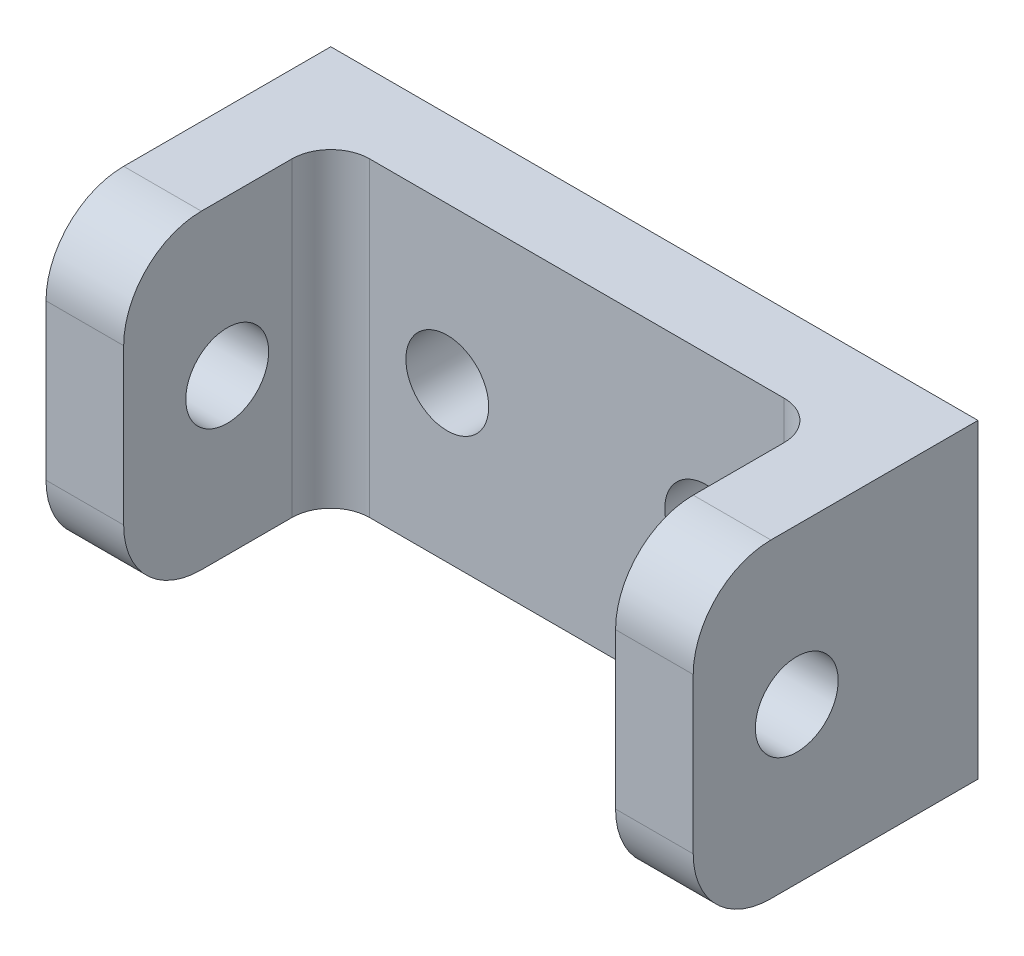
ISO-10303-21;
HEADER;
FILE_DESCRIPTION(('STEP AP214'),'2;1');
FILE_NAME('part.step','',(''),(''),'','','');
FILE_SCHEMA(('AUTOMOTIVE_DESIGN { 1 0 10303 214 1 1 1 1 }'));
ENDSEC;
DATA;
#1=APPLICATION_CONTEXT('core data for automotive mechanical design processes');
#2=APPLICATION_PROTOCOL_DEFINITION('international standard','automotive_design',2000,#1);
#3=PRODUCT_CONTEXT('',#1,'mechanical');
#4=PRODUCT('Part','Part','',(#3));
#5=PRODUCT_RELATED_PRODUCT_CATEGORY('part','',(#4));
#6=PRODUCT_DEFINITION_FORMATION('','',#4);
#7=PRODUCT_DEFINITION_CONTEXT('part definition',#1,'design');
#8=PRODUCT_DEFINITION('design','',#6,#7);
#9=PRODUCT_DEFINITION_SHAPE('','',#8);
#10=(LENGTH_UNIT() NAMED_UNIT(*) SI_UNIT(.MILLI.,.METRE.));
#11=(NAMED_UNIT(*) PLANE_ANGLE_UNIT() SI_UNIT($,.RADIAN.));
#12=(NAMED_UNIT(*) SI_UNIT($,.STERADIAN.) SOLID_ANGLE_UNIT());
#13=UNCERTAINTY_MEASURE_WITH_UNIT(LENGTH_MEASURE(1.E-05),#10,'distance_accuracy_value','');
#14=(GEOMETRIC_REPRESENTATION_CONTEXT(3) GLOBAL_UNCERTAINTY_ASSIGNED_CONTEXT((#13)) GLOBAL_UNIT_ASSIGNED_CONTEXT((#10,
#11,#12)) REPRESENTATION_CONTEXT('',''));
#15=CARTESIAN_POINT('',(0.,0.,0.));
#16=DIRECTION('',(0.,0.,1.));
#17=DIRECTION('',(1.,0.,0.));
#18=AXIS2_PLACEMENT_3D('',#15,#16,#17);
#19=CARTESIAN_POINT('',(0.,0.,3.));
#20=DIRECTION('',(0.,0.,1.));
#21=DIRECTION('',(1.,0.,0.));
#22=AXIS2_PLACEMENT_3D('',#19,#20,#21);
#23=PLANE('',#22);
#24=CARTESIAN_POINT('',(5.00000000000002,-24.,3.));
#25=DIRECTION('',(0.,0.,1.));
#26=DIRECTION('',(1.,0.,0.));
#27=AXIS2_PLACEMENT_3D('',#24,#25,#26);
#28=CIRCLE('',#27,1.6);
#29=CARTESIAN_POINT('',(6.60000000000002,-24.,3.));
#30=VERTEX_POINT('',#29);
#31=EDGE_CURVE('E494',#30,#30,#28,.T.);
#32=ORIENTED_EDGE('',*,*,#31,.F.);
#33=EDGE_LOOP('',(#32));
#34=FACE_BOUND('',#33,.T.);
#35=CARTESIAN_POINT('',(-4.99999999999999,-24.,3.));
#36=DIRECTION('',(0.,0.,1.));
#37=DIRECTION('',(1.,0.,0.));
#38=AXIS2_PLACEMENT_3D('',#35,#36,#37);
#39=CIRCLE('',#38,1.6);
#40=CARTESIAN_POINT('',(-3.39999999999998,-24.,3.));
#41=VERTEX_POINT('',#40);
#42=EDGE_CURVE('E500',#41,#41,#39,.T.);
#43=ORIENTED_EDGE('',*,*,#42,.F.);
#44=EDGE_LOOP('',(#43));
#45=FACE_BOUND('',#44,.T.);
#46=DIRECTION('',(1.,0.,0.));
#47=VECTOR('',#46,1.);
#48=CARTESIAN_POINT('',(12.5,-30.,3.));
#49=LINE('',#48,#47);
#50=CARTESIAN_POINT('',(-8.,-30.,3.));
#51=VERTEX_POINT('',#50);
#52=CARTESIAN_POINT('',(8.,-30.,3.));
#53=VERTEX_POINT('',#52);
#54=EDGE_CURVE('E168',#51,#53,#49,.T.);
#55=ORIENTED_EDGE('',*,*,#54,.T.);
#56=DIRECTION('',(0.,-1.,0.));
#57=VECTOR('',#56,1.);
#58=CARTESIAN_POINT('',(7.99999999999999,-18.,3.));
#59=LINE('',#58,#57);
#60=CARTESIAN_POINT('',(7.99999999999999,-18.,3.));
#61=VERTEX_POINT('',#60);
#62=EDGE_CURVE('E56',#53,#61,#59,.F.);
#63=ORIENTED_EDGE('',*,*,#62,.T.);
#64=DIRECTION('',(-1.,0.,0.));
#65=VECTOR('',#64,1.);
#66=CARTESIAN_POINT('',(12.5,-18.,3.));
#67=LINE('',#66,#65);
#68=CARTESIAN_POINT('',(-7.99999999999999,-18.,3.));
#69=VERTEX_POINT('',#68);
#70=EDGE_CURVE('E174',#61,#69,#67,.T.);
#71=ORIENTED_EDGE('',*,*,#70,.T.);
#72=DIRECTION('',(0.,-1.,0.));
#73=VECTOR('',#72,1.);
#74=CARTESIAN_POINT('',(-8.,-30.,3.));
#75=LINE('',#74,#73);
#76=EDGE_CURVE('E197',#69,#51,#75,.T.);
#77=ORIENTED_EDGE('',*,*,#76,.T.);
#78=EDGE_LOOP('',(#55,#63,#71,#77));
#79=FACE_BOUND('',#78,.T.);
#80=ADVANCED_FACE('F35',(#34,#45,#79),#23,.T.);
#81=CARTESIAN_POINT('',(12.5,-30.,3.));
#82=DIRECTION('',(-1.,0.,0.));
#83=DIRECTION('',(0.,0.,1.));
#84=AXIS2_PLACEMENT_3D('',#81,#82,#83);
#85=PLANE('',#84);
#86=CARTESIAN_POINT('',(12.5,-24.,7.));
#87=DIRECTION('',(-1.,0.,0.));
#88=DIRECTION('',(0.,-1.,0.));
#89=AXIS2_PLACEMENT_3D('',#86,#87,#88);
#90=CIRCLE('',#89,1.6);
#91=CARTESIAN_POINT('',(12.5,-25.6,7.));
#92=VERTEX_POINT('',#91);
#93=EDGE_CURVE('E497',#92,#92,#90,.T.);
#94=ORIENTED_EDGE('',*,*,#93,.T.);
#95=EDGE_LOOP('',(#94));
#96=FACE_BOUND('',#95,.T.);
#97=DIRECTION('',(0.,0.,-1.));
#98=VECTOR('',#97,1.);
#99=CARTESIAN_POINT('',(12.5,-18.,3.));
#100=LINE('',#99,#98);
#101=CARTESIAN_POINT('',(12.5,-18.,8.));
#102=VERTEX_POINT('',#101);
#103=CARTESIAN_POINT('',(12.5,-18.,0.));
#104=VERTEX_POINT('',#103);
#105=EDGE_CURVE('E136',#102,#104,#100,.T.);
#106=ORIENTED_EDGE('',*,*,#105,.F.);
#107=CARTESIAN_POINT('',(12.5,-21.,8.));
#108=DIRECTION('',(-1.,0.,0.));
#109=DIRECTION('',(0.,0.,1.));
#110=AXIS2_PLACEMENT_3D('',#107,#108,#109);
#111=CIRCLE('',#110,3.);
#112=CARTESIAN_POINT('',(12.5,-21.,11.));
#113=VERTEX_POINT('',#112);
#114=EDGE_CURVE('E210',#102,#113,#111,.F.);
#115=ORIENTED_EDGE('',*,*,#114,.T.);
#116=DIRECTION('',(0.,1.,0.));
#117=VECTOR('',#116,1.);
#118=CARTESIAN_POINT('',(12.5,-30.,11.));
#119=LINE('',#118,#117);
#120=CARTESIAN_POINT('',(12.5,-27.,11.));
#121=VERTEX_POINT('',#120);
#122=EDGE_CURVE('E248',#121,#113,#119,.T.);
#123=ORIENTED_EDGE('',*,*,#122,.F.);
#124=CARTESIAN_POINT('',(12.5,-27.,8.));
#125=DIRECTION('',(-1.,0.,0.));
#126=DIRECTION('',(0.,0.,1.));
#127=AXIS2_PLACEMENT_3D('',#124,#125,#126);
#128=CIRCLE('',#127,3.);
#129=CARTESIAN_POINT('',(12.5,-30.,8.));
#130=VERTEX_POINT('',#129);
#131=EDGE_CURVE('E208',#121,#130,#128,.F.);
#132=ORIENTED_EDGE('',*,*,#131,.T.);
#133=DIRECTION('',(0.,0.,-1.));
#134=VECTOR('',#133,1.);
#135=CARTESIAN_POINT('',(12.5,-30.,3.));
#136=LINE('',#135,#134);
#137=CARTESIAN_POINT('',(12.5,-30.,0.));
#138=VERTEX_POINT('',#137);
#139=EDGE_CURVE('E160',#130,#138,#136,.T.);
#140=ORIENTED_EDGE('',*,*,#139,.T.);
#141=DIRECTION('',(0.,1.,0.));
#142=VECTOR('',#141,1.);
#143=CARTESIAN_POINT('',(12.5,-30.,0.));
#144=LINE('',#143,#142);
#145=EDGE_CURVE('E154',#138,#104,#144,.T.);
#146=ORIENTED_EDGE('',*,*,#145,.T.);
#147=EDGE_LOOP('',(#106,#115,#123,#132,#140,#146));
#148=FACE_BOUND('',#147,.T.);
#149=ADVANCED_FACE('F158',(#96,#148),#85,.F.);
#150=CARTESIAN_POINT('',(12.5,-18.,3.));
#151=DIRECTION('',(0.,-1.,0.));
#152=DIRECTION('',(1.,0.,0.));
#153=AXIS2_PLACEMENT_3D('',#150,#151,#152);
#154=PLANE('',#153);
#155=DIRECTION('',(0.,0.,-1.));
#156=VECTOR('',#155,1.);
#157=CARTESIAN_POINT('',(9.49999999999999,-18.,3.));
#158=LINE('',#157,#156);
#159=CARTESIAN_POINT('',(9.49999999999999,-18.,8.));
#160=VERTEX_POINT('',#159);
#161=CARTESIAN_POINT('',(9.49999999999999,-18.,4.5));
#162=VERTEX_POINT('',#161);
#163=EDGE_CURVE('E232',#160,#162,#158,.T.);
#164=ORIENTED_EDGE('',*,*,#163,.F.);
#165=DIRECTION('',(1.,0.,0.));
#166=VECTOR('',#165,1.);
#167=CARTESIAN_POINT('',(12.5,-18.,8.));
#168=LINE('',#167,#166);
#169=EDGE_CURVE('E144',#160,#102,#168,.T.);
#170=ORIENTED_EDGE('',*,*,#169,.T.);
#171=ORIENTED_EDGE('',*,*,#105,.T.);
#172=DIRECTION('',(-1.,0.,0.));
#173=VECTOR('',#172,1.);
#174=CARTESIAN_POINT('',(12.5,-18.,0.));
#175=LINE('',#174,#173);
#176=CARTESIAN_POINT('',(-12.5,-18.,0.));
#177=VERTEX_POINT('',#176);
#178=EDGE_CURVE('E141',#104,#177,#175,.T.);
#179=ORIENTED_EDGE('',*,*,#178,.T.);
#180=DIRECTION('',(0.,0.,-1.));
#181=VECTOR('',#180,1.);
#182=CARTESIAN_POINT('',(-12.5,-18.,3.));
#183=LINE('',#182,#181);
#184=CARTESIAN_POINT('',(-12.5,-18.,8.));
#185=VERTEX_POINT('',#184);
#186=EDGE_CURVE('E148',#185,#177,#183,.T.);
#187=ORIENTED_EDGE('',*,*,#186,.F.);
#188=DIRECTION('',(-1.,0.,0.));
#189=VECTOR('',#188,1.);
#190=CARTESIAN_POINT('',(-9.49999999999999,-18.,8.));
#191=LINE('',#190,#189);
#192=CARTESIAN_POINT('',(-9.49999999999999,-18.,8.));
#193=VERTEX_POINT('',#192);
#194=EDGE_CURVE('E187',#185,#193,#191,.F.);
#195=ORIENTED_EDGE('',*,*,#194,.T.);
#196=DIRECTION('',(0.,0.,-1.));
#197=VECTOR('',#196,1.);
#198=CARTESIAN_POINT('',(-9.49999999999999,-18.,3.));
#199=LINE('',#198,#197);
#200=CARTESIAN_POINT('',(-9.49999999999999,-18.,4.5));
#201=VERTEX_POINT('',#200);
#202=EDGE_CURVE('E162',#193,#201,#199,.T.);
#203=ORIENTED_EDGE('',*,*,#202,.T.);
#204=CARTESIAN_POINT('',(-7.99999999999999,-18.,4.5));
#205=DIRECTION('',(0.,-1.,0.));
#206=DIRECTION('',(1.,0.,0.));
#207=AXIS2_PLACEMENT_3D('',#204,#205,#206);
#208=CIRCLE('',#207,1.5);
#209=EDGE_CURVE('E204',#201,#69,#208,.T.);
#210=ORIENTED_EDGE('',*,*,#209,.T.);
#211=ORIENTED_EDGE('',*,*,#70,.F.);
#212=CARTESIAN_POINT('',(7.99999999999999,-18.,4.5));
#213=DIRECTION('',(0.,-1.,0.));
#214=DIRECTION('',(1.,0.,0.));
#215=AXIS2_PLACEMENT_3D('',#212,#213,#214);
#216=CIRCLE('',#215,1.5);
#217=EDGE_CURVE('E11',#61,#162,#216,.T.);
#218=ORIENTED_EDGE('',*,*,#217,.T.);
#219=EDGE_LOOP('',(#164,#170,#171,#179,#187,#195,#203,#210,#211,#218));
#220=FACE_BOUND('',#219,.T.);
#221=ADVANCED_FACE('F139',(#220),#154,.F.);
#222=CARTESIAN_POINT('',(-12.5,-30.,3.));
#223=DIRECTION('',(1.,0.,0.));
#224=DIRECTION('',(0.,0.,-1.));
#225=AXIS2_PLACEMENT_3D('',#222,#223,#224);
#226=PLANE('',#225);
#227=CARTESIAN_POINT('',(-12.5,-24.,7.));
#228=DIRECTION('',(-1.,0.,0.));
#229=DIRECTION('',(0.,-1.,0.));
#230=AXIS2_PLACEMENT_3D('',#227,#228,#229);
#231=CIRCLE('',#230,1.6);
#232=CARTESIAN_POINT('',(-12.5,-25.6,7.));
#233=VERTEX_POINT('',#232);
#234=EDGE_CURVE('E238',#233,#233,#231,.T.);
#235=ORIENTED_EDGE('',*,*,#234,.F.);
#236=EDGE_LOOP('',(#235));
#237=FACE_BOUND('',#236,.T.);
#238=DIRECTION('',(0.,1.,0.));
#239=VECTOR('',#238,1.);
#240=CARTESIAN_POINT('',(-12.5,-30.,11.));
#241=LINE('',#240,#239);
#242=CARTESIAN_POINT('',(-12.5,-27.,11.));
#243=VERTEX_POINT('',#242);
#244=CARTESIAN_POINT('',(-12.5,-21.,11.));
#245=VERTEX_POINT('',#244);
#246=EDGE_CURVE('E253',#243,#245,#241,.T.);
#247=ORIENTED_EDGE('',*,*,#246,.T.);
#248=CARTESIAN_POINT('',(-12.5,-21.,8.));
#249=DIRECTION('',(1.,0.,0.));
#250=DIRECTION('',(0.,0.,-1.));
#251=AXIS2_PLACEMENT_3D('',#248,#249,#250);
#252=CIRCLE('',#251,3.);
#253=EDGE_CURVE('E185',#245,#185,#252,.F.);
#254=ORIENTED_EDGE('',*,*,#253,.T.);
#255=ORIENTED_EDGE('',*,*,#186,.T.);
#256=DIRECTION('',(0.,-1.,0.));
#257=VECTOR('',#256,1.);
#258=CARTESIAN_POINT('',(-12.5,-30.,0.));
#259=LINE('',#258,#257);
#260=CARTESIAN_POINT('',(-12.5,-30.,0.));
#261=VERTEX_POINT('',#260);
#262=EDGE_CURVE('E156',#177,#261,#259,.T.);
#263=ORIENTED_EDGE('',*,*,#262,.T.);
#264=DIRECTION('',(0.,0.,-1.));
#265=VECTOR('',#264,1.);
#266=CARTESIAN_POINT('',(-12.5,-30.,3.));
#267=LINE('',#266,#265);
#268=CARTESIAN_POINT('',(-12.5,-30.,8.));
#269=VERTEX_POINT('',#268);
#270=EDGE_CURVE('E176',#269,#261,#267,.T.);
#271=ORIENTED_EDGE('',*,*,#270,.F.);
#272=CARTESIAN_POINT('',(-12.5,-27.,8.));
#273=DIRECTION('',(1.,0.,0.));
#274=DIRECTION('',(0.,0.,-1.));
#275=AXIS2_PLACEMENT_3D('',#272,#273,#274);
#276=CIRCLE('',#275,3.);
#277=EDGE_CURVE('E183',#269,#243,#276,.F.);
#278=ORIENTED_EDGE('',*,*,#277,.T.);
#279=EDGE_LOOP('',(#247,#254,#255,#263,#271,#278));
#280=FACE_BOUND('',#279,.T.);
#281=ADVANCED_FACE('F277',(#237,#280),#226,.F.);
#282=CARTESIAN_POINT('',(12.5,-30.,3.));
#283=DIRECTION('',(0.,1.,0.));
#284=DIRECTION('',(0.,0.,1.));
#285=AXIS2_PLACEMENT_3D('',#282,#283,#284);
#286=PLANE('',#285);
#287=ORIENTED_EDGE('',*,*,#139,.F.);
#288=DIRECTION('',(1.,0.,0.));
#289=VECTOR('',#288,1.);
#290=CARTESIAN_POINT('',(12.5,-30.,8.));
#291=LINE('',#290,#289);
#292=CARTESIAN_POINT('',(9.49999999999999,-30.,8.));
#293=VERTEX_POINT('',#292);
#294=EDGE_CURVE('E221',#130,#293,#291,.F.);
#295=ORIENTED_EDGE('',*,*,#294,.T.);
#296=DIRECTION('',(0.,0.,1.));
#297=VECTOR('',#296,1.);
#298=CARTESIAN_POINT('',(9.49999999999999,-30.,3.));
#299=LINE('',#298,#297);
#300=CARTESIAN_POINT('',(9.49999999999999,-30.,4.5));
#301=VERTEX_POINT('',#300);
#302=EDGE_CURVE('E231',#301,#293,#299,.T.);
#303=ORIENTED_EDGE('',*,*,#302,.F.);
#304=CARTESIAN_POINT('',(8.,-30.,4.5));
#305=DIRECTION('',(0.,1.,0.));
#306=DIRECTION('',(0.,0.,1.));
#307=AXIS2_PLACEMENT_3D('',#304,#305,#306);
#308=CIRCLE('',#307,1.5);
#309=EDGE_CURVE('E43',#301,#53,#308,.T.);
#310=ORIENTED_EDGE('',*,*,#309,.T.);
#311=ORIENTED_EDGE('',*,*,#54,.F.);
#312=CARTESIAN_POINT('',(-8.,-30.,4.5));
#313=DIRECTION('',(0.,1.,0.));
#314=DIRECTION('',(0.,0.,1.));
#315=AXIS2_PLACEMENT_3D('',#312,#313,#314);
#316=CIRCLE('',#315,1.5);
#317=CARTESIAN_POINT('',(-9.49999999999999,-30.,4.5));
#318=VERTEX_POINT('',#317);
#319=EDGE_CURVE('E202',#51,#318,#316,.T.);
#320=ORIENTED_EDGE('',*,*,#319,.T.);
#321=DIRECTION('',(0.,0.,1.));
#322=VECTOR('',#321,1.);
#323=CARTESIAN_POINT('',(-9.49999999999999,-30.,3.));
#324=LINE('',#323,#322);
#325=CARTESIAN_POINT('',(-9.49999999999999,-30.,8.));
#326=VERTEX_POINT('',#325);
#327=EDGE_CURVE('E255',#318,#326,#324,.T.);
#328=ORIENTED_EDGE('',*,*,#327,.T.);
#329=DIRECTION('',(-1.,0.,0.));
#330=VECTOR('',#329,1.);
#331=CARTESIAN_POINT('',(-12.5,-30.,8.));
#332=LINE('',#331,#330);
#333=EDGE_CURVE('E194',#326,#269,#332,.T.);
#334=ORIENTED_EDGE('',*,*,#333,.T.);
#335=ORIENTED_EDGE('',*,*,#270,.T.);
#336=DIRECTION('',(1.,0.,0.));
#337=VECTOR('',#336,1.);
#338=CARTESIAN_POINT('',(12.5,-30.,0.));
#339=LINE('',#338,#337);
#340=EDGE_CURVE('E172',#261,#138,#339,.T.);
#341=ORIENTED_EDGE('',*,*,#340,.T.);
#342=EDGE_LOOP('',(#287,#295,#303,#310,#311,#320,#328,#334,#335,#341));
#343=FACE_BOUND('',#342,.T.);
#344=ADVANCED_FACE('F235',(#343),#286,.F.);
#345=CARTESIAN_POINT('',(0.,0.,0.));
#346=DIRECTION('',(0.,0.,1.));
#347=DIRECTION('',(1.,0.,0.));
#348=AXIS2_PLACEMENT_3D('',#345,#346,#347);
#349=PLANE('',#348);
#350=CARTESIAN_POINT('',(5.00000000000002,-24.,0.));
#351=DIRECTION('',(0.,0.,1.));
#352=DIRECTION('',(1.,0.,0.));
#353=AXIS2_PLACEMENT_3D('',#350,#351,#352);
#354=CIRCLE('',#353,1.6);
#355=CARTESIAN_POINT('',(6.60000000000002,-24.,0.));
#356=VERTEX_POINT('',#355);
#357=EDGE_CURVE('E492',#356,#356,#354,.T.);
#358=ORIENTED_EDGE('',*,*,#357,.T.);
#359=EDGE_LOOP('',(#358));
#360=FACE_BOUND('',#359,.T.);
#361=CARTESIAN_POINT('',(-4.99999999999999,-24.,0.));
#362=DIRECTION('',(0.,0.,1.));
#363=DIRECTION('',(1.,0.,0.));
#364=AXIS2_PLACEMENT_3D('',#361,#362,#363);
#365=CIRCLE('',#364,1.6);
#366=CARTESIAN_POINT('',(-3.39999999999998,-24.,0.));
#367=VERTEX_POINT('',#366);
#368=EDGE_CURVE('E495',#367,#367,#365,.T.);
#369=ORIENTED_EDGE('',*,*,#368,.T.);
#370=EDGE_LOOP('',(#369));
#371=FACE_BOUND('',#370,.T.);
#372=ORIENTED_EDGE('',*,*,#145,.F.);
#373=ORIENTED_EDGE('',*,*,#340,.F.);
#374=ORIENTED_EDGE('',*,*,#262,.F.);
#375=ORIENTED_EDGE('',*,*,#178,.F.);
#376=EDGE_LOOP('',(#372,#373,#374,#375));
#377=FACE_BOUND('',#376,.T.);
#378=ADVANCED_FACE('F152',(#360,#371,#377),#349,.F.);
#379=CARTESIAN_POINT('',(-9.49999999999999,-30.,11.));
#380=DIRECTION('',(0.,0.,1.));
#381=DIRECTION('',(1.,0.,0.));
#382=AXIS2_PLACEMENT_3D('',#379,#380,#381);
#383=PLANE('',#382);
#384=DIRECTION('',(0.,1.,0.));
#385=VECTOR('',#384,1.);
#386=CARTESIAN_POINT('',(-9.49999999999999,-30.,11.));
#387=LINE('',#386,#385);
#388=CARTESIAN_POINT('',(-9.49999999999999,-27.,11.));
#389=VERTEX_POINT('',#388);
#390=CARTESIAN_POINT('',(-9.49999999999999,-21.,11.));
#391=VERTEX_POINT('',#390);
#392=EDGE_CURVE('E165',#389,#391,#387,.T.);
#393=ORIENTED_EDGE('',*,*,#392,.T.);
#394=DIRECTION('',(-1.,0.,0.));
#395=VECTOR('',#394,1.);
#396=CARTESIAN_POINT('',(-12.5,-21.,11.));
#397=LINE('',#396,#395);
#398=EDGE_CURVE('E180',#391,#245,#397,.T.);
#399=ORIENTED_EDGE('',*,*,#398,.T.);
#400=ORIENTED_EDGE('',*,*,#246,.F.);
#401=DIRECTION('',(-1.,0.,0.));
#402=VECTOR('',#401,1.);
#403=CARTESIAN_POINT('',(-9.49999999999999,-27.,11.));
#404=LINE('',#403,#402);
#405=EDGE_CURVE('E147',#243,#389,#404,.F.);
#406=ORIENTED_EDGE('',*,*,#405,.T.);
#407=EDGE_LOOP('',(#393,#399,#400,#406));
#408=FACE_BOUND('',#407,.T.);
#409=ADVANCED_FACE('F311',(#408),#383,.T.);
#410=CARTESIAN_POINT('',(-9.49999999999999,0.,0.));
#411=DIRECTION('',(1.,0.,0.));
#412=DIRECTION('',(0.,1.,0.));
#413=AXIS2_PLACEMENT_3D('',#410,#411,#412);
#414=PLANE('',#413);
#415=CARTESIAN_POINT('',(-9.49999999999999,-24.,7.));
#416=DIRECTION('',(-1.,0.,0.));
#417=DIRECTION('',(0.,-1.,0.));
#418=AXIS2_PLACEMENT_3D('',#415,#416,#417);
#419=CIRCLE('',#418,1.6);
#420=CARTESIAN_POINT('',(-9.49999999999999,-25.6,7.));
#421=VERTEX_POINT('',#420);
#422=EDGE_CURVE('E242',#421,#421,#419,.T.);
#423=ORIENTED_EDGE('',*,*,#422,.T.);
#424=EDGE_LOOP('',(#423));
#425=FACE_BOUND('',#424,.T.);
#426=ORIENTED_EDGE('',*,*,#327,.F.);
#427=DIRECTION('',(0.,-1.,0.));
#428=VECTOR('',#427,1.);
#429=CARTESIAN_POINT('',(-9.49999999999999,-18.,4.5));
#430=LINE('',#429,#428);
#431=EDGE_CURVE('E200',#318,#201,#430,.F.);
#432=ORIENTED_EDGE('',*,*,#431,.T.);
#433=ORIENTED_EDGE('',*,*,#202,.F.);
#434=CARTESIAN_POINT('',(-9.49999999999999,-21.,8.));
#435=DIRECTION('',(1.,0.,0.));
#436=DIRECTION('',(0.,1.,0.));
#437=AXIS2_PLACEMENT_3D('',#434,#435,#436);
#438=CIRCLE('',#437,3.);
#439=EDGE_CURVE('E192',#193,#391,#438,.T.);
#440=ORIENTED_EDGE('',*,*,#439,.T.);
#441=ORIENTED_EDGE('',*,*,#392,.F.);
#442=CARTESIAN_POINT('',(-9.49999999999999,-27.,8.));
#443=DIRECTION('',(1.,0.,0.));
#444=DIRECTION('',(0.,1.,0.));
#445=AXIS2_PLACEMENT_3D('',#442,#443,#444);
#446=CIRCLE('',#445,3.);
#447=EDGE_CURVE('E189',#389,#326,#446,.T.);
#448=ORIENTED_EDGE('',*,*,#447,.T.);
#449=EDGE_LOOP('',(#426,#432,#433,#440,#441,#448));
#450=FACE_BOUND('',#449,.T.);
#451=ADVANCED_FACE('F268',(#425,#450),#414,.T.);
#452=CARTESIAN_POINT('',(-9.5,-21.,8.));
#453=DIRECTION('',(1.,0.,0.));
#454=DIRECTION('',(0.,1.,0.));
#455=AXIS2_PLACEMENT_3D('',#452,#453,#454);
#456=CYLINDRICAL_SURFACE('',#455,3.);
#457=ORIENTED_EDGE('',*,*,#439,.F.);
#458=ORIENTED_EDGE('',*,*,#194,.F.);
#459=ORIENTED_EDGE('',*,*,#253,.F.);
#460=ORIENTED_EDGE('',*,*,#398,.F.);
#461=EDGE_LOOP('',(#457,#458,#459,#460));
#462=FACE_BOUND('',#461,.T.);
#463=ADVANCED_FACE('F323',(#462),#456,.T.);
#464=CARTESIAN_POINT('',(12.5,-27.,8.));
#465=DIRECTION('',(1.,0.,0.));
#466=DIRECTION('',(0.,0.,-1.));
#467=AXIS2_PLACEMENT_3D('',#464,#465,#466);
#468=CYLINDRICAL_SURFACE('',#467,3.);
#469=ORIENTED_EDGE('',*,*,#447,.F.);
#470=ORIENTED_EDGE('',*,*,#405,.F.);
#471=ORIENTED_EDGE('',*,*,#277,.F.);
#472=ORIENTED_EDGE('',*,*,#333,.F.);
#473=EDGE_LOOP('',(#469,#470,#471,#472));
#474=FACE_BOUND('',#473,.T.);
#475=ADVANCED_FACE('F274',(#474),#468,.T.);
#476=CARTESIAN_POINT('',(-7.99999999999999,0.,4.5));
#477=DIRECTION('',(0.,1.,0.));
#478=DIRECTION('',(-1.,0.,0.));
#479=AXIS2_PLACEMENT_3D('',#476,#477,#478);
#480=CYLINDRICAL_SURFACE('',#479,1.5);
#481=ORIENTED_EDGE('',*,*,#209,.F.);
#482=ORIENTED_EDGE('',*,*,#431,.F.);
#483=ORIENTED_EDGE('',*,*,#319,.F.);
#484=ORIENTED_EDGE('',*,*,#76,.F.);
#485=EDGE_LOOP('',(#481,#482,#483,#484));
#486=FACE_BOUND('',#485,.T.);
#487=ADVANCED_FACE('F265',(#486),#480,.F.);
#488=CARTESIAN_POINT('',(-9.49999999999999,-24.,7.));
#489=DIRECTION('',(-1.,0.,0.));
#490=DIRECTION('',(0.,-1.,0.));
#491=AXIS2_PLACEMENT_3D('',#488,#489,#490);
#492=CYLINDRICAL_SURFACE('',#491,1.6);
#493=ORIENTED_EDGE('',*,*,#422,.F.);
#494=EDGE_LOOP('',(#493));
#495=FACE_BOUND('',#494,.T.);
#496=ORIENTED_EDGE('',*,*,#234,.T.);
#497=EDGE_LOOP('',(#496));
#498=FACE_BOUND('',#497,.T.);
#499=ADVANCED_FACE('F329',(#495,#498),#492,.F.);
#500=CARTESIAN_POINT('',(9.49999999999999,-30.,11.));
#501=DIRECTION('',(0.,0.,-1.));
#502=DIRECTION('',(-1.,0.,0.));
#503=AXIS2_PLACEMENT_3D('',#500,#501,#502);
#504=PLANE('',#503);
#505=ORIENTED_EDGE('',*,*,#122,.T.);
#506=DIRECTION('',(1.,0.,0.));
#507=VECTOR('',#506,1.);
#508=CARTESIAN_POINT('',(9.49999999999999,-21.,11.));
#509=LINE('',#508,#507);
#510=CARTESIAN_POINT('',(9.49999999999999,-21.,11.));
#511=VERTEX_POINT('',#510);
#512=EDGE_CURVE('E215',#113,#511,#509,.F.);
#513=ORIENTED_EDGE('',*,*,#512,.T.);
#514=DIRECTION('',(0.,1.,0.));
#515=VECTOR('',#514,1.);
#516=CARTESIAN_POINT('',(9.49999999999999,-30.,11.));
#517=LINE('',#516,#515);
#518=CARTESIAN_POINT('',(9.49999999999999,-27.,11.));
#519=VERTEX_POINT('',#518);
#520=EDGE_CURVE('E239',#519,#511,#517,.T.);
#521=ORIENTED_EDGE('',*,*,#520,.F.);
#522=DIRECTION('',(1.,0.,0.));
#523=VECTOR('',#522,1.);
#524=CARTESIAN_POINT('',(9.49999999999999,-27.,11.));
#525=LINE('',#524,#523);
#526=EDGE_CURVE('E212',#519,#121,#525,.T.);
#527=ORIENTED_EDGE('',*,*,#526,.T.);
#528=EDGE_LOOP('',(#505,#513,#521,#527));
#529=FACE_BOUND('',#528,.T.);
#530=ADVANCED_FACE('F285',(#529),#504,.F.);
#531=CARTESIAN_POINT('',(9.49999999999999,0.,0.));
#532=DIRECTION('',(-1.,0.,0.));
#533=DIRECTION('',(0.,1.,0.));
#534=AXIS2_PLACEMENT_3D('',#531,#532,#533);
#535=PLANE('',#534);
#536=CARTESIAN_POINT('',(9.49999999999999,-24.,7.));
#537=DIRECTION('',(-1.,0.,0.));
#538=DIRECTION('',(0.,-1.,0.));
#539=AXIS2_PLACEMENT_3D('',#536,#537,#538);
#540=CIRCLE('',#539,1.6);
#541=CARTESIAN_POINT('',(9.49999999999999,-25.6,7.));
#542=VERTEX_POINT('',#541);
#543=EDGE_CURVE('E251',#542,#542,#540,.T.);
#544=ORIENTED_EDGE('',*,*,#543,.F.);
#545=EDGE_LOOP('',(#544));
#546=FACE_BOUND('',#545,.T.);
#547=ORIENTED_EDGE('',*,*,#163,.T.);
#548=DIRECTION('',(0.,-1.,0.));
#549=VECTOR('',#548,1.);
#550=CARTESIAN_POINT('',(9.5,-30.,4.5));
#551=LINE('',#550,#549);
#552=EDGE_CURVE('E224',#162,#301,#551,.T.);
#553=ORIENTED_EDGE('',*,*,#552,.T.);
#554=ORIENTED_EDGE('',*,*,#302,.T.);
#555=CARTESIAN_POINT('',(9.49999999999999,-27.,8.));
#556=DIRECTION('',(-1.,0.,0.));
#557=DIRECTION('',(0.,-1.,0.));
#558=AXIS2_PLACEMENT_3D('',#555,#556,#557);
#559=CIRCLE('',#558,3.);
#560=EDGE_CURVE('E217',#293,#519,#559,.T.);
#561=ORIENTED_EDGE('',*,*,#560,.T.);
#562=ORIENTED_EDGE('',*,*,#520,.T.);
#563=CARTESIAN_POINT('',(9.49999999999999,-21.,8.));
#564=DIRECTION('',(-1.,0.,0.));
#565=DIRECTION('',(0.,-1.,0.));
#566=AXIS2_PLACEMENT_3D('',#563,#564,#565);
#567=CIRCLE('',#566,3.);
#568=EDGE_CURVE('E219',#511,#160,#567,.T.);
#569=ORIENTED_EDGE('',*,*,#568,.T.);
#570=EDGE_LOOP('',(#547,#553,#554,#561,#562,#569));
#571=FACE_BOUND('',#570,.T.);
#572=ADVANCED_FACE('F230',(#546,#571),#535,.T.);
#573=CARTESIAN_POINT('',(12.5,-21.,8.));
#574=DIRECTION('',(1.,0.,0.));
#575=DIRECTION('',(0.,1.,0.));
#576=AXIS2_PLACEMENT_3D('',#573,#574,#575);
#577=CYLINDRICAL_SURFACE('',#576,3.);
#578=ORIENTED_EDGE('',*,*,#568,.F.);
#579=ORIENTED_EDGE('',*,*,#512,.F.);
#580=ORIENTED_EDGE('',*,*,#114,.F.);
#581=ORIENTED_EDGE('',*,*,#169,.F.);
#582=EDGE_LOOP('',(#578,#579,#580,#581));
#583=FACE_BOUND('',#582,.T.);
#584=ADVANCED_FACE('F289',(#583),#577,.T.);
#585=CARTESIAN_POINT('',(9.49999999999999,-27.,8.));
#586=DIRECTION('',(1.,0.,0.));
#587=DIRECTION('',(0.,0.,-1.));
#588=AXIS2_PLACEMENT_3D('',#585,#586,#587);
#589=CYLINDRICAL_SURFACE('',#588,3.);
#590=ORIENTED_EDGE('',*,*,#560,.F.);
#591=ORIENTED_EDGE('',*,*,#294,.F.);
#592=ORIENTED_EDGE('',*,*,#131,.F.);
#593=ORIENTED_EDGE('',*,*,#526,.F.);
#594=EDGE_LOOP('',(#590,#591,#592,#593));
#595=FACE_BOUND('',#594,.T.);
#596=ADVANCED_FACE('F280',(#595),#589,.T.);
#597=CARTESIAN_POINT('',(7.99999999999999,0.,4.5));
#598=DIRECTION('',(0.,1.,0.));
#599=DIRECTION('',(-1.,0.,0.));
#600=AXIS2_PLACEMENT_3D('',#597,#598,#599);
#601=CYLINDRICAL_SURFACE('',#600,1.5);
#602=ORIENTED_EDGE('',*,*,#217,.F.);
#603=ORIENTED_EDGE('',*,*,#62,.F.);
#604=ORIENTED_EDGE('',*,*,#309,.F.);
#605=ORIENTED_EDGE('',*,*,#552,.F.);
#606=EDGE_LOOP('',(#602,#603,#604,#605));
#607=FACE_BOUND('',#606,.T.);
#608=ADVANCED_FACE('F37',(#607),#601,.F.);
#609=CARTESIAN_POINT('',(9.49999999999999,-24.,7.));
#610=DIRECTION('',(1.,0.,0.));
#611=DIRECTION('',(0.,1.,0.));
#612=AXIS2_PLACEMENT_3D('',#609,#610,#611);
#613=CYLINDRICAL_SURFACE('',#612,1.6);
#614=ORIENTED_EDGE('',*,*,#543,.T.);
#615=EDGE_LOOP('',(#614));
#616=FACE_BOUND('',#615,.T.);
#617=ORIENTED_EDGE('',*,*,#93,.F.);
#618=EDGE_LOOP('',(#617));
#619=FACE_BOUND('',#618,.T.);
#620=ADVANCED_FACE('F434',(#616,#619),#613,.F.);
#621=CARTESIAN_POINT('',(-4.99999999999999,-24.,0.));
#622=DIRECTION('',(0.,0.,1.));
#623=DIRECTION('',(1.,0.,0.));
#624=AXIS2_PLACEMENT_3D('',#621,#622,#623);
#625=CYLINDRICAL_SURFACE('',#624,1.6);
#626=ORIENTED_EDGE('',*,*,#368,.F.);
#627=EDGE_LOOP('',(#626));
#628=FACE_BOUND('',#627,.T.);
#629=ORIENTED_EDGE('',*,*,#42,.T.);
#630=EDGE_LOOP('',(#629));
#631=FACE_BOUND('',#630,.T.);
#632=ADVANCED_FACE('F439',(#628,#631),#625,.F.);
#633=CARTESIAN_POINT('',(5.00000000000002,-24.,0.));
#634=DIRECTION('',(0.,0.,1.));
#635=DIRECTION('',(1.,0.,0.));
#636=AXIS2_PLACEMENT_3D('',#633,#634,#635);
#637=CYLINDRICAL_SURFACE('',#636,1.6);
#638=ORIENTED_EDGE('',*,*,#357,.F.);
#639=EDGE_LOOP('',(#638));
#640=FACE_BOUND('',#639,.T.);
#641=ORIENTED_EDGE('',*,*,#31,.T.);
#642=EDGE_LOOP('',(#641));
#643=FACE_BOUND('',#642,.T.);
#644=ADVANCED_FACE('F475',(#640,#643),#637,.F.);
#645=CLOSED_SHELL('',(#80,#149,#221,#281,#344,#378,#409,#451,#463,#475,#487,#499,#530,#572,#584,
#596,#608,#620,#632,#644));
#646=MANIFOLD_SOLID_BREP('B2',#645);
#647=ADVANCED_BREP_SHAPE_REPRESENTATION('',(#18,#646),#14);
#648=SHAPE_DEFINITION_REPRESENTATION(#9,#647);
ENDSEC;
END-ISO-10303-21;
